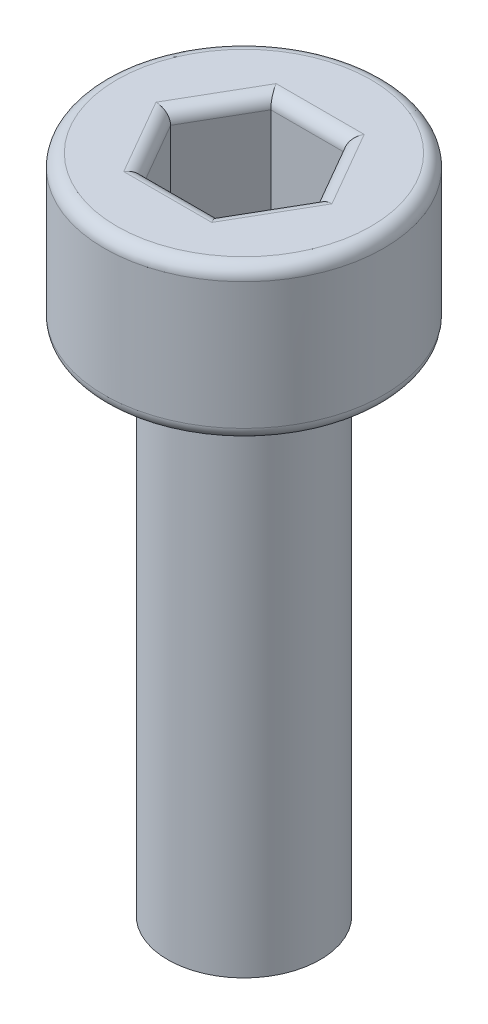
ISO-10303-21;
HEADER;
FILE_DESCRIPTION(('STEP AP214'),'2;1');
FILE_NAME('part.step','',(''),(''),'','','');
FILE_SCHEMA(('AUTOMOTIVE_DESIGN { 1 0 10303 214 1 1 1 1 }'));
ENDSEC;
DATA;
#1=APPLICATION_CONTEXT('core data for automotive mechanical design processes');
#2=APPLICATION_PROTOCOL_DEFINITION('international standard','automotive_design',2000,#1);
#3=PRODUCT_CONTEXT('',#1,'mechanical');
#4=PRODUCT('Part','Part','',(#3));
#5=PRODUCT_RELATED_PRODUCT_CATEGORY('part','',(#4));
#6=PRODUCT_DEFINITION_FORMATION('','',#4);
#7=PRODUCT_DEFINITION_CONTEXT('part definition',#1,'design');
#8=PRODUCT_DEFINITION('design','',#6,#7);
#9=PRODUCT_DEFINITION_SHAPE('','',#8);
#10=(LENGTH_UNIT() NAMED_UNIT(*) SI_UNIT(.MILLI.,.METRE.));
#11=(NAMED_UNIT(*) PLANE_ANGLE_UNIT() SI_UNIT($,.RADIAN.));
#12=(NAMED_UNIT(*) SI_UNIT($,.STERADIAN.) SOLID_ANGLE_UNIT());
#13=UNCERTAINTY_MEASURE_WITH_UNIT(LENGTH_MEASURE(1.E-05),#10,'distance_accuracy_value','');
#14=(GEOMETRIC_REPRESENTATION_CONTEXT(3) GLOBAL_UNCERTAINTY_ASSIGNED_CONTEXT((#13)) GLOBAL_UNIT_ASSIGNED_CONTEXT((#10,
#11,#12)) REPRESENTATION_CONTEXT('',''));
#15=CARTESIAN_POINT('',(0.,0.,0.));
#16=DIRECTION('',(0.,0.,1.));
#17=DIRECTION('',(1.,0.,0.));
#18=AXIS2_PLACEMENT_3D('',#15,#16,#17);
#19=CARTESIAN_POINT('',(2.44943897592423E-11,3.,0.));
#20=DIRECTION('',(0.,-1.,0.));
#21=DIRECTION('',(1.,0.,0.));
#22=AXIS2_PLACEMENT_3D('',#19,#20,#21);
#23=PLANE('',#22);
#24=CARTESIAN_POINT('',(0.,3.,0.));
#25=DIRECTION('',(0.,-1.,0.));
#26=DIRECTION('',(1.,0.,0.));
#27=AXIS2_PLACEMENT_3D('',#24,#25,#26);
#28=CIRCLE('',#27,2.50000000002449);
#29=CARTESIAN_POINT('',(2.50000000002449,3.,0.));
#30=VERTEX_POINT('',#29);
#31=EDGE_CURVE('E179',#30,#30,#28,.F.);
#32=ORIENTED_EDGE('',*,*,#31,.T.);
#33=EDGE_LOOP('',(#32));
#34=FACE_BOUND('',#33,.T.);
#35=DIRECTION('',(-0.5,0.,0.866025403784439));
#36=VECTOR('',#35,1.);
#37=CARTESIAN_POINT('',(-1.29903810567053,3.,-0.750000000010607));
#38=LINE('',#37,#36);
#39=CARTESIAN_POINT('',(-1.73205080756888,3.,0.));
#40=VERTEX_POINT('',#39);
#41=CARTESIAN_POINT('',(-0.866025403784439,3.,-1.5));
#42=VERTEX_POINT('',#41);
#43=EDGE_CURVE('E174',#40,#42,#38,.F.);
#44=ORIENTED_EDGE('',*,*,#43,.T.);
#45=DIRECTION('',(-1.,0.,0.));
#46=VECTOR('',#45,1.);
#47=CARTESIAN_POINT('',(2.44943897592423E-11,3.,-1.5));
#48=LINE('',#47,#46);
#49=CARTESIAN_POINT('',(0.866025403784438,3.,-1.5));
#50=VERTEX_POINT('',#49);
#51=EDGE_CURVE('E176',#42,#50,#48,.F.);
#52=ORIENTED_EDGE('',*,*,#51,.T.);
#53=DIRECTION('',(-0.5,0.,-0.866025403784439));
#54=VECTOR('',#53,1.);
#55=CARTESIAN_POINT('',(1.29903810568278,3.,-0.749999999989393));
#56=LINE('',#55,#54);
#57=CARTESIAN_POINT('',(1.73205080756888,3.,0.));
#58=VERTEX_POINT('',#57);
#59=EDGE_CURVE('E166',#50,#58,#56,.F.);
#60=ORIENTED_EDGE('',*,*,#59,.T.);
#61=DIRECTION('',(0.5,0.,-0.866025403784439));
#62=VECTOR('',#61,1.);
#63=CARTESIAN_POINT('',(1.29903810568278,3.,0.749999999989393));
#64=LINE('',#63,#62);
#65=CARTESIAN_POINT('',(0.866025403784438,3.,1.5));
#66=VERTEX_POINT('',#65);
#67=EDGE_CURVE('E168',#58,#66,#64,.F.);
#68=ORIENTED_EDGE('',*,*,#67,.T.);
#69=DIRECTION('',(1.,0.,0.));
#70=VECTOR('',#69,1.);
#71=CARTESIAN_POINT('',(2.44943897592423E-11,3.,1.5));
#72=LINE('',#71,#70);
#73=CARTESIAN_POINT('',(-0.86602540378444,3.,1.5));
#74=VERTEX_POINT('',#73);
#75=EDGE_CURVE('E170',#66,#74,#72,.F.);
#76=ORIENTED_EDGE('',*,*,#75,.T.);
#77=DIRECTION('',(0.5,0.,0.866025403784439));
#78=VECTOR('',#77,1.);
#79=CARTESIAN_POINT('',(-1.29903810567054,3.,0.750000000010607));
#80=LINE('',#79,#78);
#81=EDGE_CURVE('E172',#74,#40,#80,.F.);
#82=ORIENTED_EDGE('',*,*,#81,.T.);
#83=EDGE_LOOP('',(#44,#52,#60,#68,#76,#82));
#84=FACE_BOUND('',#83,.T.);
#85=ADVANCED_FACE('F33',(#34,#84),#23,.F.);
#86=CARTESIAN_POINT('',(0.,21.3223243250921,0.));
#87=DIRECTION('',(0.,1.,0.));
#88=DIRECTION('',(-1.,0.,0.));
#89=AXIS2_PLACEMENT_3D('',#86,#87,#88);
#90=CYLINDRICAL_SURFACE('',#89,2.75000000002449);
#91=CARTESIAN_POINT('',(0.,0.25,0.));
#92=DIRECTION('',(0.,1.,0.));
#93=DIRECTION('',(-1.,0.,0.));
#94=AXIS2_PLACEMENT_3D('',#91,#92,#93);
#95=CIRCLE('',#94,2.75000000002449);
#96=CARTESIAN_POINT('',(-2.75000000002449,0.25,0.));
#97=VERTEX_POINT('',#96);
#98=EDGE_CURVE('E163',#97,#97,#95,.T.);
#99=ORIENTED_EDGE('',*,*,#98,.T.);
#100=EDGE_LOOP('',(#99));
#101=FACE_BOUND('',#100,.T.);
#102=CARTESIAN_POINT('',(0.,2.75,0.));
#103=DIRECTION('',(0.,-1.,0.));
#104=DIRECTION('',(1.,0.,0.));
#105=AXIS2_PLACEMENT_3D('',#102,#103,#104);
#106=CIRCLE('',#105,2.75000000002449);
#107=CARTESIAN_POINT('',(2.75000000002449,2.75,0.));
#108=VERTEX_POINT('',#107);
#109=EDGE_CURVE('E160',#108,#108,#106,.T.);
#110=ORIENTED_EDGE('',*,*,#109,.T.);
#111=EDGE_LOOP('',(#110));
#112=FACE_BOUND('',#111,.T.);
#113=ADVANCED_FACE('F240',(#101,#112),#90,.T.);
#114=CARTESIAN_POINT('',(2.75000000002449,0.,0.));
#115=DIRECTION('',(0.,1.,0.));
#116=DIRECTION('',(-1.,0.,0.));
#117=AXIS2_PLACEMENT_3D('',#114,#115,#116);
#118=PLANE('',#117);
#119=CARTESIAN_POINT('',(0.,0.,0.));
#120=DIRECTION('',(0.,1.,0.));
#121=DIRECTION('',(-1.,0.,0.));
#122=AXIS2_PLACEMENT_3D('',#119,#120,#121);
#123=CIRCLE('',#122,1.75);
#124=CARTESIAN_POINT('',(-1.75,0.,0.));
#125=VERTEX_POINT('',#124);
#126=EDGE_CURVE('E154',#125,#125,#123,.T.);
#127=ORIENTED_EDGE('',*,*,#126,.T.);
#128=EDGE_LOOP('',(#127));
#129=FACE_BOUND('',#128,.T.);
#130=CARTESIAN_POINT('',(0.,0.,0.));
#131=DIRECTION('',(0.,1.,0.));
#132=DIRECTION('',(-1.,0.,0.));
#133=AXIS2_PLACEMENT_3D('',#130,#131,#132);
#134=CIRCLE('',#133,2.50000000002449);
#135=CARTESIAN_POINT('',(-2.50000000002449,0.,0.));
#136=VERTEX_POINT('',#135);
#137=EDGE_CURVE('E151',#136,#136,#134,.F.);
#138=ORIENTED_EDGE('',*,*,#137,.T.);
#139=EDGE_LOOP('',(#138));
#140=FACE_BOUND('',#139,.T.);
#141=ADVANCED_FACE('F246',(#129,#140),#118,.F.);
#142=CARTESIAN_POINT('',(0.,21.3223243250921,0.));
#143=DIRECTION('',(0.,1.,0.));
#144=DIRECTION('',(-1.,0.,0.));
#145=AXIS2_PLACEMENT_3D('',#142,#143,#144);
#146=CYLINDRICAL_SURFACE('',#145,1.5);
#147=CARTESIAN_POINT('',(0.,-0.25,0.));
#148=DIRECTION('',(0.,1.,0.));
#149=DIRECTION('',(-1.,0.,0.));
#150=AXIS2_PLACEMENT_3D('',#147,#148,#149);
#151=CIRCLE('',#150,1.5);
#152=CARTESIAN_POINT('',(-1.5,-0.25,0.));
#153=VERTEX_POINT('',#152);
#154=EDGE_CURVE('E157',#153,#153,#151,.F.);
#155=ORIENTED_EDGE('',*,*,#154,.T.);
#156=EDGE_LOOP('',(#155));
#157=FACE_BOUND('',#156,.T.);
#158=CARTESIAN_POINT('',(0.,-10.,0.));
#159=DIRECTION('',(0.,1.,0.));
#160=DIRECTION('',(-1.,0.,0.));
#161=AXIS2_PLACEMENT_3D('',#158,#159,#160);
#162=CIRCLE('',#161,1.5);
#163=CARTESIAN_POINT('',(-1.49999999999999,-10.,0.));
#164=VERTEX_POINT('',#163);
#165=EDGE_CURVE('E139',#164,#164,#162,.T.);
#166=ORIENTED_EDGE('',*,*,#165,.T.);
#167=EDGE_LOOP('',(#166));
#168=FACE_BOUND('',#167,.T.);
#169=ADVANCED_FACE('F338',(#157,#168),#146,.T.);
#170=CARTESIAN_POINT('',(1.5,-10.,0.));
#171=DIRECTION('',(0.,1.,0.));
#172=DIRECTION('',(-1.,0.,0.));
#173=AXIS2_PLACEMENT_3D('',#170,#171,#172);
#174=PLANE('',#173);
#175=ORIENTED_EDGE('',*,*,#165,.F.);
#176=EDGE_LOOP('',(#175));
#177=FACE_BOUND('',#176,.T.);
#178=ADVANCED_FACE('F236',(#177),#174,.F.);
#179=CARTESIAN_POINT('',(0.721687836487032,1.,1.25));
#180=DIRECTION('',(0.866025403784439,0.,0.5));
#181=DIRECTION('',(0.5,0.,-0.866025403784439));
#182=AXIS2_PLACEMENT_3D('',#179,#180,#181);
#183=PLANE('',#182);
#184=DIRECTION('',(0.,1.,0.));
#185=VECTOR('',#184,1.);
#186=CARTESIAN_POINT('',(0.721687836487032,1.,1.25));
#187=LINE('',#186,#185);
#188=CARTESIAN_POINT('',(0.721687836487032,1.,1.25));
#189=VERTEX_POINT('',#188);
#190=CARTESIAN_POINT('',(0.721687836487031,2.75,1.25));
#191=VERTEX_POINT('',#190);
#192=EDGE_CURVE('E137',#189,#191,#187,.T.);
#193=ORIENTED_EDGE('',*,*,#192,.T.);
#194=DIRECTION('',(0.5,0.,-0.866025403784439));
#195=VECTOR('',#194,1.);
#196=CARTESIAN_POINT('',(0.721687836487031,2.75,1.25));
#197=LINE('',#196,#195);
#198=CARTESIAN_POINT('',(1.44337567297406,2.75,0.));
#199=VERTEX_POINT('',#198);
#200=EDGE_CURVE('E42',#191,#199,#197,.T.);
#201=ORIENTED_EDGE('',*,*,#200,.T.);
#202=DIRECTION('',(0.,1.,0.));
#203=VECTOR('',#202,1.);
#204=CARTESIAN_POINT('',(1.44337567297406,1.,0.));
#205=LINE('',#204,#203);
#206=CARTESIAN_POINT('',(1.44337567297406,1.,0.));
#207=VERTEX_POINT('',#206);
#208=EDGE_CURVE('E103',#207,#199,#205,.T.);
#209=ORIENTED_EDGE('',*,*,#208,.F.);
#210=DIRECTION('',(0.5,0.,-0.866025403784439));
#211=VECTOR('',#210,1.);
#212=CARTESIAN_POINT('',(0.721687836487032,1.,1.25));
#213=LINE('',#212,#211);
#214=EDGE_CURVE('E107',#189,#207,#213,.T.);
#215=ORIENTED_EDGE('',*,*,#214,.F.);
#216=EDGE_LOOP('',(#193,#201,#209,#215));
#217=FACE_BOUND('',#216,.T.);
#218=ADVANCED_FACE('F105',(#217),#183,.F.);
#219=CARTESIAN_POINT('',(-0.721687836487033,1.,1.25));
#220=DIRECTION('',(0.,0.,1.));
#221=DIRECTION('',(1.,0.,0.));
#222=AXIS2_PLACEMENT_3D('',#219,#220,#221);
#223=PLANE('',#222);
#224=DIRECTION('',(0.,1.,0.));
#225=VECTOR('',#224,1.);
#226=CARTESIAN_POINT('',(-0.721687836487033,1.,1.25));
#227=LINE('',#226,#225);
#228=CARTESIAN_POINT('',(-0.721687836487033,1.,1.25));
#229=VERTEX_POINT('',#228);
#230=CARTESIAN_POINT('',(-0.721687836487033,2.75,1.25));
#231=VERTEX_POINT('',#230);
#232=EDGE_CURVE('E140',#229,#231,#227,.T.);
#233=ORIENTED_EDGE('',*,*,#232,.T.);
#234=DIRECTION('',(1.,0.,0.));
#235=VECTOR('',#234,1.);
#236=CARTESIAN_POINT('',(-0.721687836487033,2.75,1.25));
#237=LINE('',#236,#235);
#238=EDGE_CURVE('E57',#231,#191,#237,.T.);
#239=ORIENTED_EDGE('',*,*,#238,.T.);
#240=ORIENTED_EDGE('',*,*,#192,.F.);
#241=DIRECTION('',(1.,0.,0.));
#242=VECTOR('',#241,1.);
#243=CARTESIAN_POINT('',(-0.721687836487033,1.,1.25));
#244=LINE('',#243,#242);
#245=EDGE_CURVE('E112',#229,#189,#244,.T.);
#246=ORIENTED_EDGE('',*,*,#245,.F.);
#247=EDGE_LOOP('',(#233,#239,#240,#246));
#248=FACE_BOUND('',#247,.T.);
#249=ADVANCED_FACE('F228',(#248),#223,.F.);
#250=CARTESIAN_POINT('',(-1.44337567297407,1.,0.));
#251=DIRECTION('',(-0.866025403784439,0.,0.5));
#252=DIRECTION('',(0.5,0.,0.866025403784439));
#253=AXIS2_PLACEMENT_3D('',#250,#251,#252);
#254=PLANE('',#253);
#255=DIRECTION('',(0.,1.,0.));
#256=VECTOR('',#255,1.);
#257=CARTESIAN_POINT('',(-1.44337567297407,1.,0.));
#258=LINE('',#257,#256);
#259=CARTESIAN_POINT('',(-1.44337567297407,1.,0.));
#260=VERTEX_POINT('',#259);
#261=CARTESIAN_POINT('',(-1.44337567297407,2.75,0.));
#262=VERTEX_POINT('',#261);
#263=EDGE_CURVE('E142',#260,#262,#258,.T.);
#264=ORIENTED_EDGE('',*,*,#263,.T.);
#265=DIRECTION('',(0.5,0.,0.866025403784439));
#266=VECTOR('',#265,1.);
#267=CARTESIAN_POINT('',(-1.44337567297407,2.75,0.));
#268=LINE('',#267,#266);
#269=EDGE_CURVE('E187',#262,#231,#268,.T.);
#270=ORIENTED_EDGE('',*,*,#269,.T.);
#271=ORIENTED_EDGE('',*,*,#232,.F.);
#272=DIRECTION('',(0.5,0.,0.866025403784439));
#273=VECTOR('',#272,1.);
#274=CARTESIAN_POINT('',(-1.44337567297407,1.,0.));
#275=LINE('',#274,#273);
#276=EDGE_CURVE('E134',#260,#229,#275,.T.);
#277=ORIENTED_EDGE('',*,*,#276,.F.);
#278=EDGE_LOOP('',(#264,#270,#271,#277));
#279=FACE_BOUND('',#278,.T.);
#280=ADVANCED_FACE('F227',(#279),#254,.F.);
#281=CARTESIAN_POINT('',(-0.721687836487032,1.,-1.25));
#282=DIRECTION('',(-0.866025403784439,0.,-0.5));
#283=DIRECTION('',(-0.5,0.,0.866025403784439));
#284=AXIS2_PLACEMENT_3D('',#281,#282,#283);
#285=PLANE('',#284);
#286=DIRECTION('',(0.,1.,0.));
#287=VECTOR('',#286,1.);
#288=CARTESIAN_POINT('',(-0.721687836487032,1.,-1.25));
#289=LINE('',#288,#287);
#290=CARTESIAN_POINT('',(-0.721687836487032,1.,-1.25));
#291=VERTEX_POINT('',#290);
#292=CARTESIAN_POINT('',(-0.721687836487032,2.75,-1.25));
#293=VERTEX_POINT('',#292);
#294=EDGE_CURVE('E145',#291,#293,#289,.T.);
#295=ORIENTED_EDGE('',*,*,#294,.T.);
#296=DIRECTION('',(-0.5,0.,0.866025403784439));
#297=VECTOR('',#296,1.);
#298=CARTESIAN_POINT('',(-0.721687836487032,2.75,-1.25));
#299=LINE('',#298,#297);
#300=EDGE_CURVE('E185',#293,#262,#299,.T.);
#301=ORIENTED_EDGE('',*,*,#300,.T.);
#302=ORIENTED_EDGE('',*,*,#263,.F.);
#303=DIRECTION('',(-0.5,0.,0.866025403784439));
#304=VECTOR('',#303,1.);
#305=CARTESIAN_POINT('',(-0.721687836487032,1.,-1.25));
#306=LINE('',#305,#304);
#307=EDGE_CURVE('E131',#291,#260,#306,.T.);
#308=ORIENTED_EDGE('',*,*,#307,.F.);
#309=EDGE_LOOP('',(#295,#301,#302,#308));
#310=FACE_BOUND('',#309,.T.);
#311=ADVANCED_FACE('F224',(#310),#285,.F.);
#312=CARTESIAN_POINT('',(0.721687836487032,1.,-1.25));
#313=DIRECTION('',(0.,0.,-1.));
#314=DIRECTION('',(-1.,0.,0.));
#315=AXIS2_PLACEMENT_3D('',#312,#313,#314);
#316=PLANE('',#315);
#317=DIRECTION('',(0.,1.,0.));
#318=VECTOR('',#317,1.);
#319=CARTESIAN_POINT('',(0.721687836487032,1.,-1.25));
#320=LINE('',#319,#318);
#321=CARTESIAN_POINT('',(0.721687836487032,1.,-1.25));
#322=VERTEX_POINT('',#321);
#323=CARTESIAN_POINT('',(0.721687836487031,2.75,-1.25));
#324=VERTEX_POINT('',#323);
#325=EDGE_CURVE('E111',#322,#324,#320,.T.);
#326=ORIENTED_EDGE('',*,*,#325,.T.);
#327=DIRECTION('',(-1.,0.,0.));
#328=VECTOR('',#327,1.);
#329=CARTESIAN_POINT('',(0.721687836487031,2.75,-1.25));
#330=LINE('',#329,#328);
#331=EDGE_CURVE('E182',#324,#293,#330,.T.);
#332=ORIENTED_EDGE('',*,*,#331,.T.);
#333=ORIENTED_EDGE('',*,*,#294,.F.);
#334=DIRECTION('',(-1.,0.,0.));
#335=VECTOR('',#334,1.);
#336=CARTESIAN_POINT('',(0.721687836487032,1.,-1.25));
#337=LINE('',#336,#335);
#338=EDGE_CURVE('E121',#322,#291,#337,.T.);
#339=ORIENTED_EDGE('',*,*,#338,.F.);
#340=EDGE_LOOP('',(#326,#332,#333,#339));
#341=FACE_BOUND('',#340,.T.);
#342=ADVANCED_FACE('F220',(#341),#316,.F.);
#343=CARTESIAN_POINT('',(1.44337567297406,1.,0.));
#344=DIRECTION('',(0.866025403784439,0.,-0.5));
#345=DIRECTION('',(-0.5,0.,-0.866025403784439));
#346=AXIS2_PLACEMENT_3D('',#343,#344,#345);
#347=PLANE('',#346);
#348=ORIENTED_EDGE('',*,*,#208,.T.);
#349=DIRECTION('',(-0.5,0.,-0.866025403784439));
#350=VECTOR('',#349,1.);
#351=CARTESIAN_POINT('',(1.44337567297406,2.75,0.));
#352=LINE('',#351,#350);
#353=EDGE_CURVE('E11',#199,#324,#352,.T.);
#354=ORIENTED_EDGE('',*,*,#353,.T.);
#355=ORIENTED_EDGE('',*,*,#325,.F.);
#356=DIRECTION('',(-0.5,0.,-0.866025403784439));
#357=VECTOR('',#356,1.);
#358=CARTESIAN_POINT('',(1.44337567297406,1.,0.));
#359=LINE('',#358,#357);
#360=EDGE_CURVE('E115',#207,#322,#359,.T.);
#361=ORIENTED_EDGE('',*,*,#360,.F.);
#362=EDGE_LOOP('',(#348,#354,#355,#361));
#363=FACE_BOUND('',#362,.T.);
#364=ADVANCED_FACE('F116',(#363),#347,.F.);
#365=CARTESIAN_POINT('',(0.,1.,0.));
#366=DIRECTION('',(0.,1.,0.));
#367=DIRECTION('',(0.,0.,1.));
#368=AXIS2_PLACEMENT_3D('',#365,#366,#367);
#369=PLANE('',#368);
#370=ORIENTED_EDGE('',*,*,#214,.T.);
#371=ORIENTED_EDGE('',*,*,#360,.T.);
#372=ORIENTED_EDGE('',*,*,#338,.T.);
#373=ORIENTED_EDGE('',*,*,#307,.T.);
#374=ORIENTED_EDGE('',*,*,#276,.T.);
#375=ORIENTED_EDGE('',*,*,#245,.T.);
#376=EDGE_LOOP('',(#370,#371,#372,#373,#374,#375));
#377=FACE_BOUND('',#376,.T.);
#378=ADVANCED_FACE('F123',(#377),#369,.T.);
#379=CARTESIAN_POINT('',(0.,-0.25,0.));
#380=DIRECTION('',(0.,1.,0.));
#381=DIRECTION('',(-1.,0.,0.));
#382=AXIS2_PLACEMENT_3D('',#379,#380,#381);
#383=TOROIDAL_SURFACE('',#382,1.75,0.25);
#384=ORIENTED_EDGE('',*,*,#154,.F.);
#385=EDGE_LOOP('',(#384));
#386=FACE_BOUND('',#385,.T.);
#387=ORIENTED_EDGE('',*,*,#126,.F.);
#388=EDGE_LOOP('',(#387));
#389=FACE_BOUND('',#388,.T.);
#390=ADVANCED_FACE('F252',(#386,#389),#383,.F.);
#391=CARTESIAN_POINT('',(0.,0.25,0.));
#392=DIRECTION('',(0.,1.,0.));
#393=DIRECTION('',(-1.,0.,0.));
#394=AXIS2_PLACEMENT_3D('',#391,#392,#393);
#395=TOROIDAL_SURFACE('',#394,2.50000000002449,0.25);
#396=ORIENTED_EDGE('',*,*,#137,.F.);
#397=EDGE_LOOP('',(#396));
#398=FACE_BOUND('',#397,.T.);
#399=ORIENTED_EDGE('',*,*,#98,.F.);
#400=EDGE_LOOP('',(#399));
#401=FACE_BOUND('',#400,.T.);
#402=ADVANCED_FACE('F255',(#398,#401),#395,.T.);
#403=CARTESIAN_POINT('',(0.,2.75,0.));
#404=DIRECTION('',(0.,-1.,0.));
#405=DIRECTION('',(1.,0.,0.));
#406=AXIS2_PLACEMENT_3D('',#403,#404,#405);
#407=TOROIDAL_SURFACE('',#406,2.50000000002449,0.25);
#408=ORIENTED_EDGE('',*,*,#109,.F.);
#409=EDGE_LOOP('',(#408));
#410=FACE_BOUND('',#409,.T.);
#411=ORIENTED_EDGE('',*,*,#31,.F.);
#412=EDGE_LOOP('',(#411));
#413=FACE_BOUND('',#412,.T.);
#414=ADVANCED_FACE('F259',(#410,#413),#407,.T.);
#415=CARTESIAN_POINT('',(-0.721687836487033,2.75,1.5));
#416=DIRECTION('',(1.,0.,0.));
#417=DIRECTION('',(0.,1.,0.));
#418=AXIS2_PLACEMENT_3D('',#415,#416,#417);
#419=CYLINDRICAL_SURFACE('',#418,0.25);
#420=CARTESIAN_POINT('',(-0.86602540378444,2.75,1.5));
#421=DIRECTION('',(0.866025403784439,0.,0.5));
#422=DIRECTION('',(-0.5,0.,0.866025403784439));
#423=AXIS2_PLACEMENT_3D('',#420,#421,#422);
#424=ELLIPSE('',#423,0.288675134594813,0.25);
#425=EDGE_CURVE('E128',#74,#231,#424,.F.);
#426=ORIENTED_EDGE('',*,*,#425,.F.);
#427=ORIENTED_EDGE('',*,*,#75,.F.);
#428=CARTESIAN_POINT('',(0.866025403784438,2.75,1.5));
#429=DIRECTION('',(0.866025403784439,0.,-0.5));
#430=DIRECTION('',(0.5,0.,0.866025403784439));
#431=AXIS2_PLACEMENT_3D('',#428,#429,#430);
#432=ELLIPSE('',#431,0.288675134594813,0.25);
#433=EDGE_CURVE('E37',#191,#66,#432,.T.);
#434=ORIENTED_EDGE('',*,*,#433,.F.);
#435=ORIENTED_EDGE('',*,*,#238,.F.);
#436=EDGE_LOOP('',(#426,#427,#434,#435));
#437=FACE_BOUND('',#436,.T.);
#438=ADVANCED_FACE('F35',(#437),#419,.T.);
#439=CARTESIAN_POINT('',(0.938194187433141,2.75,1.375));
#440=DIRECTION('',(0.5,0.,-0.866025403784439));
#441=DIRECTION('',(-0.866025403784439,0.,-0.5));
#442=AXIS2_PLACEMENT_3D('',#439,#440,#441);
#443=CYLINDRICAL_SURFACE('',#442,0.25);
#444=ORIENTED_EDGE('',*,*,#433,.T.);
#445=ORIENTED_EDGE('',*,*,#67,.F.);
#446=CARTESIAN_POINT('',(1.73205080756888,2.75,0.));
#447=DIRECTION('',(0.,0.,-1.));
#448=DIRECTION('',(1.,0.,0.));
#449=AXIS2_PLACEMENT_3D('',#446,#447,#448);
#450=ELLIPSE('',#449,0.288675134594813,0.25);
#451=EDGE_CURVE('E198',#199,#58,#450,.T.);
#452=ORIENTED_EDGE('',*,*,#451,.F.);
#453=ORIENTED_EDGE('',*,*,#200,.F.);
#454=EDGE_LOOP('',(#444,#445,#452,#453));
#455=FACE_BOUND('',#454,.T.);
#456=ADVANCED_FACE('F212',(#455),#443,.T.);
#457=CARTESIAN_POINT('',(-1.65988202392018,2.75,0.125));
#458=DIRECTION('',(0.5,0.,0.866025403784439));
#459=DIRECTION('',(0.866025403784439,0.,-0.5));
#460=AXIS2_PLACEMENT_3D('',#457,#458,#459);
#461=CYLINDRICAL_SURFACE('',#460,0.25);
#462=ORIENTED_EDGE('',*,*,#425,.T.);
#463=ORIENTED_EDGE('',*,*,#269,.F.);
#464=CARTESIAN_POINT('',(-1.73205080756888,2.75,0.));
#465=DIRECTION('',(0.,0.,1.));
#466=DIRECTION('',(-1.,0.,0.));
#467=AXIS2_PLACEMENT_3D('',#464,#465,#466);
#468=ELLIPSE('',#467,0.288675134594813,0.25);
#469=EDGE_CURVE('E195',#40,#262,#468,.F.);
#470=ORIENTED_EDGE('',*,*,#469,.F.);
#471=ORIENTED_EDGE('',*,*,#81,.F.);
#472=EDGE_LOOP('',(#462,#463,#470,#471));
#473=FACE_BOUND('',#472,.T.);
#474=ADVANCED_FACE('F205',(#473),#461,.T.);
#475=CARTESIAN_POINT('',(1.65988202392017,2.75,-0.125));
#476=DIRECTION('',(-0.5,0.,-0.866025403784439));
#477=DIRECTION('',(-0.866025403784439,0.,0.5));
#478=AXIS2_PLACEMENT_3D('',#475,#476,#477);
#479=CYLINDRICAL_SURFACE('',#478,0.25);
#480=ORIENTED_EDGE('',*,*,#451,.T.);
#481=ORIENTED_EDGE('',*,*,#59,.F.);
#482=CARTESIAN_POINT('',(0.866025403784438,2.75,-1.5));
#483=DIRECTION('',(-0.866025403784439,0.,-0.5));
#484=DIRECTION('',(-0.5,0.,0.866025403784439));
#485=AXIS2_PLACEMENT_3D('',#482,#483,#484);
#486=ELLIPSE('',#485,0.288675134594813,0.25);
#487=EDGE_CURVE('E193',#324,#50,#486,.T.);
#488=ORIENTED_EDGE('',*,*,#487,.F.);
#489=ORIENTED_EDGE('',*,*,#353,.F.);
#490=EDGE_LOOP('',(#480,#481,#488,#489));
#491=FACE_BOUND('',#490,.T.);
#492=ADVANCED_FACE('F217',(#491),#479,.T.);
#493=CARTESIAN_POINT('',(-0.938194187433142,2.75,-1.375));
#494=DIRECTION('',(-0.5,0.,0.866025403784439));
#495=DIRECTION('',(0.866025403784439,0.,0.5));
#496=AXIS2_PLACEMENT_3D('',#493,#494,#495);
#497=CYLINDRICAL_SURFACE('',#496,0.25);
#498=ORIENTED_EDGE('',*,*,#469,.T.);
#499=ORIENTED_EDGE('',*,*,#300,.F.);
#500=CARTESIAN_POINT('',(-0.866025403784438,2.75,-1.5));
#501=DIRECTION('',(-0.866025403784439,0.,0.5));
#502=DIRECTION('',(-0.5,0.,-0.866025403784439));
#503=AXIS2_PLACEMENT_3D('',#500,#501,#502);
#504=ELLIPSE('',#503,0.288675134594813,0.25);
#505=EDGE_CURVE('E191',#42,#293,#504,.F.);
#506=ORIENTED_EDGE('',*,*,#505,.F.);
#507=ORIENTED_EDGE('',*,*,#43,.F.);
#508=EDGE_LOOP('',(#498,#499,#506,#507));
#509=FACE_BOUND('',#508,.T.);
#510=ADVANCED_FACE('F267',(#509),#497,.T.);
#511=CARTESIAN_POINT('',(0.721687836487031,2.75,-1.5));
#512=DIRECTION('',(-1.,0.,0.));
#513=DIRECTION('',(0.,-1.,0.));
#514=AXIS2_PLACEMENT_3D('',#511,#512,#513);
#515=CYLINDRICAL_SURFACE('',#514,0.25);
#516=ORIENTED_EDGE('',*,*,#487,.T.);
#517=ORIENTED_EDGE('',*,*,#51,.F.);
#518=ORIENTED_EDGE('',*,*,#505,.T.);
#519=ORIENTED_EDGE('',*,*,#331,.F.);
#520=EDGE_LOOP('',(#516,#517,#518,#519));
#521=FACE_BOUND('',#520,.T.);
#522=ADVANCED_FACE('F264',(#521),#515,.T.);
#523=CLOSED_SHELL('',(#85,#113,#141,#169,#178,#218,#249,#280,#311,#342,#364,#378,#390,#402,#414,
#438,#456,#474,#492,#510,#522));
#524=MANIFOLD_SOLID_BREP('B2',#523);
#525=ADVANCED_BREP_SHAPE_REPRESENTATION('',(#18,#524),#14);
#526=SHAPE_DEFINITION_REPRESENTATION(#9,#525);
ENDSEC;
END-ISO-10303-21;
